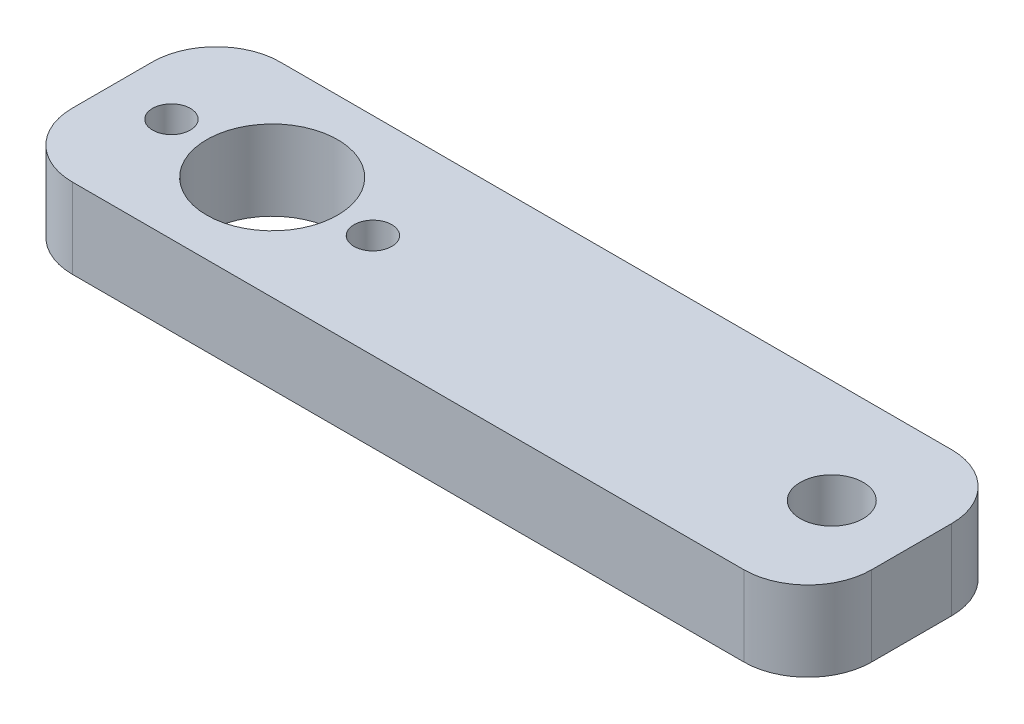
ISO-10303-21;
HEADER;
FILE_DESCRIPTION(('STEP AP214'),'2;1');
FILE_NAME('part.step','',(''),(''),'','','');
FILE_SCHEMA(('AUTOMOTIVE_DESIGN { 1 0 10303 214 1 1 1 1 }'));
ENDSEC;
DATA;
#1=APPLICATION_CONTEXT('core data for automotive mechanical design processes');
#2=APPLICATION_PROTOCOL_DEFINITION('international standard','automotive_design',2000,#1);
#3=PRODUCT_CONTEXT('',#1,'mechanical');
#4=PRODUCT('Part','Part','',(#3));
#5=PRODUCT_RELATED_PRODUCT_CATEGORY('part','',(#4));
#6=PRODUCT_DEFINITION_FORMATION('','',#4);
#7=PRODUCT_DEFINITION_CONTEXT('part definition',#1,'design');
#8=PRODUCT_DEFINITION('design','',#6,#7);
#9=PRODUCT_DEFINITION_SHAPE('','',#8);
#10=(LENGTH_UNIT() NAMED_UNIT(*) SI_UNIT(.MILLI.,.METRE.));
#11=(NAMED_UNIT(*) PLANE_ANGLE_UNIT() SI_UNIT($,.RADIAN.));
#12=(NAMED_UNIT(*) SI_UNIT($,.STERADIAN.) SOLID_ANGLE_UNIT());
#13=UNCERTAINTY_MEASURE_WITH_UNIT(LENGTH_MEASURE(1.E-05),#10,'distance_accuracy_value','');
#14=(GEOMETRIC_REPRESENTATION_CONTEXT(3) GLOBAL_UNCERTAINTY_ASSIGNED_CONTEXT((#13)) GLOBAL_UNIT_ASSIGNED_CONTEXT((#10,
#11,#12)) REPRESENTATION_CONTEXT('',''));
#15=CARTESIAN_POINT('',(0.,0.,0.));
#16=DIRECTION('',(0.,0.,1.));
#17=DIRECTION('',(1.,0.,0.));
#18=AXIS2_PLACEMENT_3D('',#15,#16,#17);
#19=CARTESIAN_POINT('',(0.,6.35,0.));
#20=DIRECTION('',(1.,0.,0.));
#21=DIRECTION('',(0.,0.,-1.));
#22=AXIS2_PLACEMENT_3D('',#19,#20,#21);
#23=PLANE('',#22);
#24=DIRECTION('',(0.,0.,1.));
#25=VECTOR('',#24,1.);
#26=CARTESIAN_POINT('',(0.,0.,0.));
#27=LINE('',#26,#25);
#28=CARTESIAN_POINT('',(0.,0.,-11.43));
#29=VERTEX_POINT('',#28);
#30=CARTESIAN_POINT('',(0.,0.,-5.08));
#31=VERTEX_POINT('',#30);
#32=EDGE_CURVE('E157',#29,#31,#27,.T.);
#33=ORIENTED_EDGE('',*,*,#32,.T.);
#34=DIRECTION('',(0.,-1.,0.));
#35=VECTOR('',#34,1.);
#36=CARTESIAN_POINT('',(0.,6.35,-5.08));
#37=LINE('',#36,#35);
#38=CARTESIAN_POINT('',(0.,6.35,-5.08));
#39=VERTEX_POINT('',#38);
#40=EDGE_CURVE('E11',#31,#39,#37,.F.);
#41=ORIENTED_EDGE('',*,*,#40,.T.);
#42=DIRECTION('',(0.,0.,1.));
#43=VECTOR('',#42,1.);
#44=CARTESIAN_POINT('',(0.,6.35,0.));
#45=LINE('',#44,#43);
#46=CARTESIAN_POINT('',(0.,6.35,-11.43));
#47=VERTEX_POINT('',#46);
#48=EDGE_CURVE('E125',#47,#39,#45,.T.);
#49=ORIENTED_EDGE('',*,*,#48,.F.);
#50=DIRECTION('',(0.,-1.,0.));
#51=VECTOR('',#50,1.);
#52=CARTESIAN_POINT('',(0.,6.35,-11.43));
#53=LINE('',#52,#51);
#54=EDGE_CURVE('E41',#47,#29,#53,.T.);
#55=ORIENTED_EDGE('',*,*,#54,.T.);
#56=EDGE_LOOP('',(#33,#41,#49,#55));
#57=FACE_BOUND('',#56,.T.);
#58=ADVANCED_FACE('F33',(#57),#23,.F.);
#59=CARTESIAN_POINT('',(0.,6.35,0.));
#60=DIRECTION('',(0.,0.,-1.));
#61=DIRECTION('',(-1.,0.,0.));
#62=AXIS2_PLACEMENT_3D('',#59,#60,#61);
#63=PLANE('',#62);
#64=DIRECTION('',(1.,0.,0.));
#65=VECTOR('',#64,1.);
#66=CARTESIAN_POINT('',(0.,0.,0.));
#67=LINE('',#66,#65);
#68=CARTESIAN_POINT('',(5.08,0.,0.));
#69=VERTEX_POINT('',#68);
#70=CARTESIAN_POINT('',(58.42,0.,0.));
#71=VERTEX_POINT('',#70);
#72=EDGE_CURVE('E130',#69,#71,#67,.T.);
#73=ORIENTED_EDGE('',*,*,#72,.T.);
#74=DIRECTION('',(0.,-1.,0.));
#75=VECTOR('',#74,1.);
#76=CARTESIAN_POINT('',(58.42,6.35,0.));
#77=LINE('',#76,#75);
#78=CARTESIAN_POINT('',(58.42,6.35,0.));
#79=VERTEX_POINT('',#78);
#80=EDGE_CURVE('E48',#71,#79,#77,.F.);
#81=ORIENTED_EDGE('',*,*,#80,.T.);
#82=DIRECTION('',(1.,0.,0.));
#83=VECTOR('',#82,1.);
#84=CARTESIAN_POINT('',(0.,6.35,0.));
#85=LINE('',#84,#83);
#86=CARTESIAN_POINT('',(5.08,6.35,0.));
#87=VERTEX_POINT('',#86);
#88=EDGE_CURVE('E128',#87,#79,#85,.T.);
#89=ORIENTED_EDGE('',*,*,#88,.F.);
#90=DIRECTION('',(0.,-1.,0.));
#91=VECTOR('',#90,1.);
#92=CARTESIAN_POINT('',(5.08,6.35,0.));
#93=LINE('',#92,#91);
#94=EDGE_CURVE('E149',#87,#69,#93,.T.);
#95=ORIENTED_EDGE('',*,*,#94,.T.);
#96=EDGE_LOOP('',(#73,#81,#89,#95));
#97=FACE_BOUND('',#96,.T.);
#98=ADVANCED_FACE('F212',(#97),#63,.F.);
#99=CARTESIAN_POINT('',(63.5,6.35,0.));
#100=DIRECTION('',(-1.,0.,0.));
#101=DIRECTION('',(0.,0.,1.));
#102=AXIS2_PLACEMENT_3D('',#99,#100,#101);
#103=PLANE('',#102);
#104=DIRECTION('',(0.,0.,-1.));
#105=VECTOR('',#104,1.);
#106=CARTESIAN_POINT('',(63.5,0.,0.));
#107=LINE('',#106,#105);
#108=CARTESIAN_POINT('',(63.5,0.,-5.08));
#109=VERTEX_POINT('',#108);
#110=CARTESIAN_POINT('',(63.5,0.,-11.43));
#111=VERTEX_POINT('',#110);
#112=EDGE_CURVE('E126',#109,#111,#107,.T.);
#113=ORIENTED_EDGE('',*,*,#112,.T.);
#114=DIRECTION('',(0.,-1.,0.));
#115=VECTOR('',#114,1.);
#116=CARTESIAN_POINT('',(63.5,6.35,-11.43));
#117=LINE('',#116,#115);
#118=CARTESIAN_POINT('',(63.5,6.35,-11.43));
#119=VERTEX_POINT('',#118);
#120=EDGE_CURVE('E104',#111,#119,#117,.F.);
#121=ORIENTED_EDGE('',*,*,#120,.T.);
#122=DIRECTION('',(0.,0.,-1.));
#123=VECTOR('',#122,1.);
#124=CARTESIAN_POINT('',(63.5,6.35,0.));
#125=LINE('',#124,#123);
#126=CARTESIAN_POINT('',(63.5,6.35,-5.08));
#127=VERTEX_POINT('',#126);
#128=EDGE_CURVE('E169',#127,#119,#125,.T.);
#129=ORIENTED_EDGE('',*,*,#128,.F.);
#130=DIRECTION('',(0.,-1.,0.));
#131=VECTOR('',#130,1.);
#132=CARTESIAN_POINT('',(63.5,6.35,-5.08));
#133=LINE('',#132,#131);
#134=EDGE_CURVE('E109',#127,#109,#133,.T.);
#135=ORIENTED_EDGE('',*,*,#134,.T.);
#136=EDGE_LOOP('',(#113,#121,#129,#135));
#137=FACE_BOUND('',#136,.T.);
#138=ADVANCED_FACE('F209',(#137),#103,.F.);
#139=CARTESIAN_POINT('',(0.,6.35,-16.51));
#140=DIRECTION('',(0.,0.,1.));
#141=DIRECTION('',(1.,0.,0.));
#142=AXIS2_PLACEMENT_3D('',#139,#140,#141);
#143=PLANE('',#142);
#144=DIRECTION('',(-1.,0.,0.));
#145=VECTOR('',#144,1.);
#146=CARTESIAN_POINT('',(0.,6.35,-16.51));
#147=LINE('',#146,#145);
#148=CARTESIAN_POINT('',(58.42,6.35,-16.51));
#149=VERTEX_POINT('',#148);
#150=CARTESIAN_POINT('',(5.08,6.35,-16.51));
#151=VERTEX_POINT('',#150);
#152=EDGE_CURVE('E119',#149,#151,#147,.T.);
#153=ORIENTED_EDGE('',*,*,#152,.F.);
#154=DIRECTION('',(0.,-1.,0.));
#155=VECTOR('',#154,1.);
#156=CARTESIAN_POINT('',(58.42,6.35,-16.51));
#157=LINE('',#156,#155);
#158=CARTESIAN_POINT('',(58.42,0.,-16.51));
#159=VERTEX_POINT('',#158);
#160=EDGE_CURVE('E103',#149,#159,#157,.T.);
#161=ORIENTED_EDGE('',*,*,#160,.T.);
#162=DIRECTION('',(-1.,0.,0.));
#163=VECTOR('',#162,1.);
#164=CARTESIAN_POINT('',(0.,0.,-16.51));
#165=LINE('',#164,#163);
#166=CARTESIAN_POINT('',(5.08,0.,-16.51));
#167=VERTEX_POINT('',#166);
#168=EDGE_CURVE('E116',#159,#167,#165,.T.);
#169=ORIENTED_EDGE('',*,*,#168,.T.);
#170=DIRECTION('',(0.,-1.,0.));
#171=VECTOR('',#170,1.);
#172=CARTESIAN_POINT('',(5.08,6.35,-16.51));
#173=LINE('',#172,#171);
#174=EDGE_CURVE('E121',#167,#151,#173,.F.);
#175=ORIENTED_EDGE('',*,*,#174,.T.);
#176=EDGE_LOOP('',(#153,#161,#169,#175));
#177=FACE_BOUND('',#176,.T.);
#178=ADVANCED_FACE('F115',(#177),#143,.F.);
#179=CARTESIAN_POINT('',(0.,6.35,0.));
#180=DIRECTION('',(0.,-1.,0.));
#181=DIRECTION('',(0.,0.,-1.));
#182=AXIS2_PLACEMENT_3D('',#179,#180,#181);
#183=PLANE('',#182);
#184=CARTESIAN_POINT('',(4.699,6.35,-8.255));
#185=DIRECTION('',(0.,1.,0.));
#186=DIRECTION('',(0.,0.,1.));
#187=AXIS2_PLACEMENT_3D('',#184,#185,#186);
#188=CIRCLE('',#187,1.5);
#189=CARTESIAN_POINT('',(4.699,6.35,-6.755));
#190=VERTEX_POINT('',#189);
#191=EDGE_CURVE('E190',#190,#190,#188,.T.);
#192=ORIENTED_EDGE('',*,*,#191,.F.);
#193=EDGE_LOOP('',(#192));
#194=FACE_BOUND('',#193,.T.);
#195=CARTESIAN_POINT('',(20.701,6.35,-8.255));
#196=DIRECTION('',(0.,1.,0.));
#197=DIRECTION('',(0.,0.,1.));
#198=AXIS2_PLACEMENT_3D('',#195,#196,#197);
#199=CIRCLE('',#198,1.5);
#200=CARTESIAN_POINT('',(20.701,6.35,-6.755));
#201=VERTEX_POINT('',#200);
#202=EDGE_CURVE('E184',#201,#201,#199,.T.);
#203=ORIENTED_EDGE('',*,*,#202,.F.);
#204=EDGE_LOOP('',(#203));
#205=FACE_BOUND('',#204,.T.);
#206=CARTESIAN_POINT('',(12.7,6.35,-8.255));
#207=DIRECTION('',(0.,1.,0.));
#208=DIRECTION('',(0.,0.,1.));
#209=AXIS2_PLACEMENT_3D('',#206,#207,#208);
#210=CIRCLE('',#209,5.2);
#211=CARTESIAN_POINT('',(12.7,6.35,-3.055));
#212=VERTEX_POINT('',#211);
#213=EDGE_CURVE('E178',#212,#212,#210,.T.);
#214=ORIENTED_EDGE('',*,*,#213,.F.);
#215=EDGE_LOOP('',(#214));
#216=FACE_BOUND('',#215,.T.);
#217=CARTESIAN_POINT('',(57.15,6.35,-8.255));
#218=DIRECTION('',(0.,1.,0.));
#219=DIRECTION('',(0.,0.,1.));
#220=AXIS2_PLACEMENT_3D('',#217,#218,#219);
#221=CIRCLE('',#220,2.49999999999999);
#222=CARTESIAN_POINT('',(57.15,6.35,-5.75500000000001));
#223=VERTEX_POINT('',#222);
#224=EDGE_CURVE('E165',#223,#223,#221,.T.);
#225=ORIENTED_EDGE('',*,*,#224,.F.);
#226=EDGE_LOOP('',(#225));
#227=FACE_BOUND('',#226,.T.);
#228=ORIENTED_EDGE('',*,*,#128,.T.);
#229=CARTESIAN_POINT('',(58.42,6.35,-11.43));
#230=DIRECTION('',(0.,-1.,0.));
#231=DIRECTION('',(0.,0.,-1.));
#232=AXIS2_PLACEMENT_3D('',#229,#230,#231);
#233=CIRCLE('',#232,5.08);
#234=EDGE_CURVE('E147',#119,#149,#233,.F.);
#235=ORIENTED_EDGE('',*,*,#234,.T.);
#236=ORIENTED_EDGE('',*,*,#152,.T.);
#237=CARTESIAN_POINT('',(5.08,6.35,-11.43));
#238=DIRECTION('',(0.,-1.,0.));
#239=DIRECTION('',(0.,0.,-1.));
#240=AXIS2_PLACEMENT_3D('',#237,#238,#239);
#241=CIRCLE('',#240,5.08);
#242=EDGE_CURVE('E142',#151,#47,#241,.F.);
#243=ORIENTED_EDGE('',*,*,#242,.T.);
#244=ORIENTED_EDGE('',*,*,#48,.T.);
#245=CARTESIAN_POINT('',(5.08,6.35,-5.08));
#246=DIRECTION('',(0.,-1.,0.));
#247=DIRECTION('',(0.,0.,-1.));
#248=AXIS2_PLACEMENT_3D('',#245,#246,#247);
#249=CIRCLE('',#248,5.08);
#250=EDGE_CURVE('E55',#39,#87,#249,.F.);
#251=ORIENTED_EDGE('',*,*,#250,.T.);
#252=ORIENTED_EDGE('',*,*,#88,.T.);
#253=CARTESIAN_POINT('',(58.42,6.35,-5.08));
#254=DIRECTION('',(0.,-1.,0.));
#255=DIRECTION('',(0.,0.,-1.));
#256=AXIS2_PLACEMENT_3D('',#253,#254,#255);
#257=CIRCLE('',#256,5.08);
#258=EDGE_CURVE('E145',#79,#127,#257,.F.);
#259=ORIENTED_EDGE('',*,*,#258,.T.);
#260=EDGE_LOOP('',(#228,#235,#236,#243,#244,#251,#252,#259));
#261=FACE_BOUND('',#260,.T.);
#262=ADVANCED_FACE('F196',(#194,#205,#216,#227,#261),#183,.F.);
#263=CARTESIAN_POINT('',(0.,0.,0.));
#264=DIRECTION('',(0.,-1.,0.));
#265=DIRECTION('',(0.,0.,-1.));
#266=AXIS2_PLACEMENT_3D('',#263,#264,#265);
#267=PLANE('',#266);
#268=CARTESIAN_POINT('',(4.699,0.,-8.255));
#269=DIRECTION('',(0.,1.,0.));
#270=DIRECTION('',(0.,0.,1.));
#271=AXIS2_PLACEMENT_3D('',#268,#269,#270);
#272=CIRCLE('',#271,1.5);
#273=CARTESIAN_POINT('',(4.699,0.,-6.755));
#274=VERTEX_POINT('',#273);
#275=EDGE_CURVE('E187',#274,#274,#272,.T.);
#276=ORIENTED_EDGE('',*,*,#275,.T.);
#277=EDGE_LOOP('',(#276));
#278=FACE_BOUND('',#277,.T.);
#279=CARTESIAN_POINT('',(20.701,0.,-8.255));
#280=DIRECTION('',(0.,1.,0.));
#281=DIRECTION('',(0.,0.,1.));
#282=AXIS2_PLACEMENT_3D('',#279,#280,#281);
#283=CIRCLE('',#282,1.5);
#284=CARTESIAN_POINT('',(20.701,0.,-6.755));
#285=VERTEX_POINT('',#284);
#286=EDGE_CURVE('E181',#285,#285,#283,.T.);
#287=ORIENTED_EDGE('',*,*,#286,.T.);
#288=EDGE_LOOP('',(#287));
#289=FACE_BOUND('',#288,.T.);
#290=CARTESIAN_POINT('',(12.7,0.,-8.255));
#291=DIRECTION('',(0.,1.,0.));
#292=DIRECTION('',(0.,0.,1.));
#293=AXIS2_PLACEMENT_3D('',#290,#291,#292);
#294=CIRCLE('',#293,5.2);
#295=CARTESIAN_POINT('',(12.7,0.,-3.055));
#296=VERTEX_POINT('',#295);
#297=EDGE_CURVE('E175',#296,#296,#294,.T.);
#298=ORIENTED_EDGE('',*,*,#297,.T.);
#299=EDGE_LOOP('',(#298));
#300=FACE_BOUND('',#299,.T.);
#301=CARTESIAN_POINT('',(57.15,0.,-8.255));
#302=DIRECTION('',(0.,1.,0.));
#303=DIRECTION('',(0.,0.,1.));
#304=AXIS2_PLACEMENT_3D('',#301,#302,#303);
#305=CIRCLE('',#304,2.5);
#306=CARTESIAN_POINT('',(57.15,0.,-5.755));
#307=VERTEX_POINT('',#306);
#308=EDGE_CURVE('E162',#307,#307,#305,.T.);
#309=ORIENTED_EDGE('',*,*,#308,.T.);
#310=EDGE_LOOP('',(#309));
#311=FACE_BOUND('',#310,.T.);
#312=ORIENTED_EDGE('',*,*,#168,.F.);
#313=CARTESIAN_POINT('',(58.42,0.,-11.43));
#314=DIRECTION('',(0.,-1.,0.));
#315=DIRECTION('',(0.,0.,-1.));
#316=AXIS2_PLACEMENT_3D('',#313,#314,#315);
#317=CIRCLE('',#316,5.08);
#318=EDGE_CURVE('E99',#159,#111,#317,.T.);
#319=ORIENTED_EDGE('',*,*,#318,.T.);
#320=ORIENTED_EDGE('',*,*,#112,.F.);
#321=CARTESIAN_POINT('',(58.42,0.,-5.08));
#322=DIRECTION('',(0.,-1.,0.));
#323=DIRECTION('',(0.,0.,-1.));
#324=AXIS2_PLACEMENT_3D('',#321,#322,#323);
#325=CIRCLE('',#324,5.08);
#326=EDGE_CURVE('E110',#109,#71,#325,.T.);
#327=ORIENTED_EDGE('',*,*,#326,.T.);
#328=ORIENTED_EDGE('',*,*,#72,.F.);
#329=CARTESIAN_POINT('',(5.08,0.,-5.08));
#330=DIRECTION('',(0.,-1.,0.));
#331=DIRECTION('',(0.,0.,-1.));
#332=AXIS2_PLACEMENT_3D('',#329,#330,#331);
#333=CIRCLE('',#332,5.08);
#334=EDGE_CURVE('E136',#69,#31,#333,.T.);
#335=ORIENTED_EDGE('',*,*,#334,.T.);
#336=ORIENTED_EDGE('',*,*,#32,.F.);
#337=CARTESIAN_POINT('',(5.08,0.,-11.43));
#338=DIRECTION('',(0.,-1.,0.));
#339=DIRECTION('',(0.,0.,-1.));
#340=AXIS2_PLACEMENT_3D('',#337,#338,#339);
#341=CIRCLE('',#340,5.08);
#342=EDGE_CURVE('E120',#29,#167,#341,.T.);
#343=ORIENTED_EDGE('',*,*,#342,.T.);
#344=EDGE_LOOP('',(#312,#319,#320,#327,#328,#335,#336,#343));
#345=FACE_BOUND('',#344,.T.);
#346=ADVANCED_FACE('F123',(#278,#289,#300,#311,#345),#267,.T.);
#347=CARTESIAN_POINT('',(57.15,6.35,-8.255));
#348=DIRECTION('',(0.,1.,0.));
#349=DIRECTION('',(0.,0.,1.));
#350=AXIS2_PLACEMENT_3D('',#347,#348,#349);
#351=CYLINDRICAL_SURFACE('',#350,2.5);
#352=ORIENTED_EDGE('',*,*,#308,.F.);
#353=EDGE_LOOP('',(#352));
#354=FACE_BOUND('',#353,.T.);
#355=ORIENTED_EDGE('',*,*,#224,.T.);
#356=EDGE_LOOP('',(#355));
#357=FACE_BOUND('',#356,.T.);
#358=ADVANCED_FACE('F278',(#354,#357),#351,.F.);
#359=CARTESIAN_POINT('',(12.7,6.35,-8.255));
#360=DIRECTION('',(0.,1.,0.));
#361=DIRECTION('',(0.,0.,1.));
#362=AXIS2_PLACEMENT_3D('',#359,#360,#361);
#363=CYLINDRICAL_SURFACE('',#362,5.2);
#364=ORIENTED_EDGE('',*,*,#297,.F.);
#365=EDGE_LOOP('',(#364));
#366=FACE_BOUND('',#365,.T.);
#367=ORIENTED_EDGE('',*,*,#213,.T.);
#368=EDGE_LOOP('',(#367));
#369=FACE_BOUND('',#368,.T.);
#370=ADVANCED_FACE('F269',(#366,#369),#363,.F.);
#371=CARTESIAN_POINT('',(20.701,6.35,-8.255));
#372=DIRECTION('',(0.,1.,0.));
#373=DIRECTION('',(0.,0.,1.));
#374=AXIS2_PLACEMENT_3D('',#371,#372,#373);
#375=CYLINDRICAL_SURFACE('',#374,1.5);
#376=ORIENTED_EDGE('',*,*,#286,.F.);
#377=EDGE_LOOP('',(#376));
#378=FACE_BOUND('',#377,.T.);
#379=ORIENTED_EDGE('',*,*,#202,.T.);
#380=EDGE_LOOP('',(#379));
#381=FACE_BOUND('',#380,.T.);
#382=ADVANCED_FACE('F260',(#378,#381),#375,.F.);
#383=CARTESIAN_POINT('',(4.699,6.35,-8.255));
#384=DIRECTION('',(0.,1.,0.));
#385=DIRECTION('',(0.,0.,1.));
#386=AXIS2_PLACEMENT_3D('',#383,#384,#385);
#387=CYLINDRICAL_SURFACE('',#386,1.5);
#388=ORIENTED_EDGE('',*,*,#275,.F.);
#389=EDGE_LOOP('',(#388));
#390=FACE_BOUND('',#389,.T.);
#391=ORIENTED_EDGE('',*,*,#191,.T.);
#392=EDGE_LOOP('',(#391));
#393=FACE_BOUND('',#392,.T.);
#394=ADVANCED_FACE('F194',(#390,#393),#387,.F.);
#395=CARTESIAN_POINT('',(58.42,6.35,-11.43));
#396=DIRECTION('',(0.,-1.,0.));
#397=DIRECTION('',(0.,0.,-1.));
#398=AXIS2_PLACEMENT_3D('',#395,#396,#397);
#399=CYLINDRICAL_SURFACE('',#398,5.08);
#400=ORIENTED_EDGE('',*,*,#234,.F.);
#401=ORIENTED_EDGE('',*,*,#120,.F.);
#402=ORIENTED_EDGE('',*,*,#318,.F.);
#403=ORIENTED_EDGE('',*,*,#160,.F.);
#404=EDGE_LOOP('',(#400,#401,#402,#403));
#405=FACE_BOUND('',#404,.T.);
#406=ADVANCED_FACE('F102',(#405),#399,.T.);
#407=CARTESIAN_POINT('',(58.42,6.35,-5.08));
#408=DIRECTION('',(0.,-1.,0.));
#409=DIRECTION('',(0.,0.,-1.));
#410=AXIS2_PLACEMENT_3D('',#407,#408,#409);
#411=CYLINDRICAL_SURFACE('',#410,5.08);
#412=ORIENTED_EDGE('',*,*,#258,.F.);
#413=ORIENTED_EDGE('',*,*,#80,.F.);
#414=ORIENTED_EDGE('',*,*,#326,.F.);
#415=ORIENTED_EDGE('',*,*,#134,.F.);
#416=EDGE_LOOP('',(#412,#413,#414,#415));
#417=FACE_BOUND('',#416,.T.);
#418=ADVANCED_FACE('F211',(#417),#411,.T.);
#419=CARTESIAN_POINT('',(5.08,6.35,-5.08));
#420=DIRECTION('',(0.,-1.,0.));
#421=DIRECTION('',(0.,0.,-1.));
#422=AXIS2_PLACEMENT_3D('',#419,#420,#421);
#423=CYLINDRICAL_SURFACE('',#422,5.08);
#424=ORIENTED_EDGE('',*,*,#250,.F.);
#425=ORIENTED_EDGE('',*,*,#40,.F.);
#426=ORIENTED_EDGE('',*,*,#334,.F.);
#427=ORIENTED_EDGE('',*,*,#94,.F.);
#428=EDGE_LOOP('',(#424,#425,#426,#427));
#429=FACE_BOUND('',#428,.T.);
#430=ADVANCED_FACE('F215',(#429),#423,.T.);
#431=CARTESIAN_POINT('',(5.08,6.35,-11.43));
#432=DIRECTION('',(0.,-1.,0.));
#433=DIRECTION('',(0.,0.,-1.));
#434=AXIS2_PLACEMENT_3D('',#431,#432,#433);
#435=CYLINDRICAL_SURFACE('',#434,5.08);
#436=ORIENTED_EDGE('',*,*,#242,.F.);
#437=ORIENTED_EDGE('',*,*,#174,.F.);
#438=ORIENTED_EDGE('',*,*,#342,.F.);
#439=ORIENTED_EDGE('',*,*,#54,.F.);
#440=EDGE_LOOP('',(#436,#437,#438,#439));
#441=FACE_BOUND('',#440,.T.);
#442=ADVANCED_FACE('F35',(#441),#435,.T.);
#443=CLOSED_SHELL('',(#58,#98,#138,#178,#262,#346,#358,#370,#382,#394,#406,#418,#430,#442));
#444=MANIFOLD_SOLID_BREP('B2',#443);
#445=ADVANCED_BREP_SHAPE_REPRESENTATION('',(#18,#444),#14);
#446=SHAPE_DEFINITION_REPRESENTATION(#9,#445);
ENDSEC;
END-ISO-10303-21;
